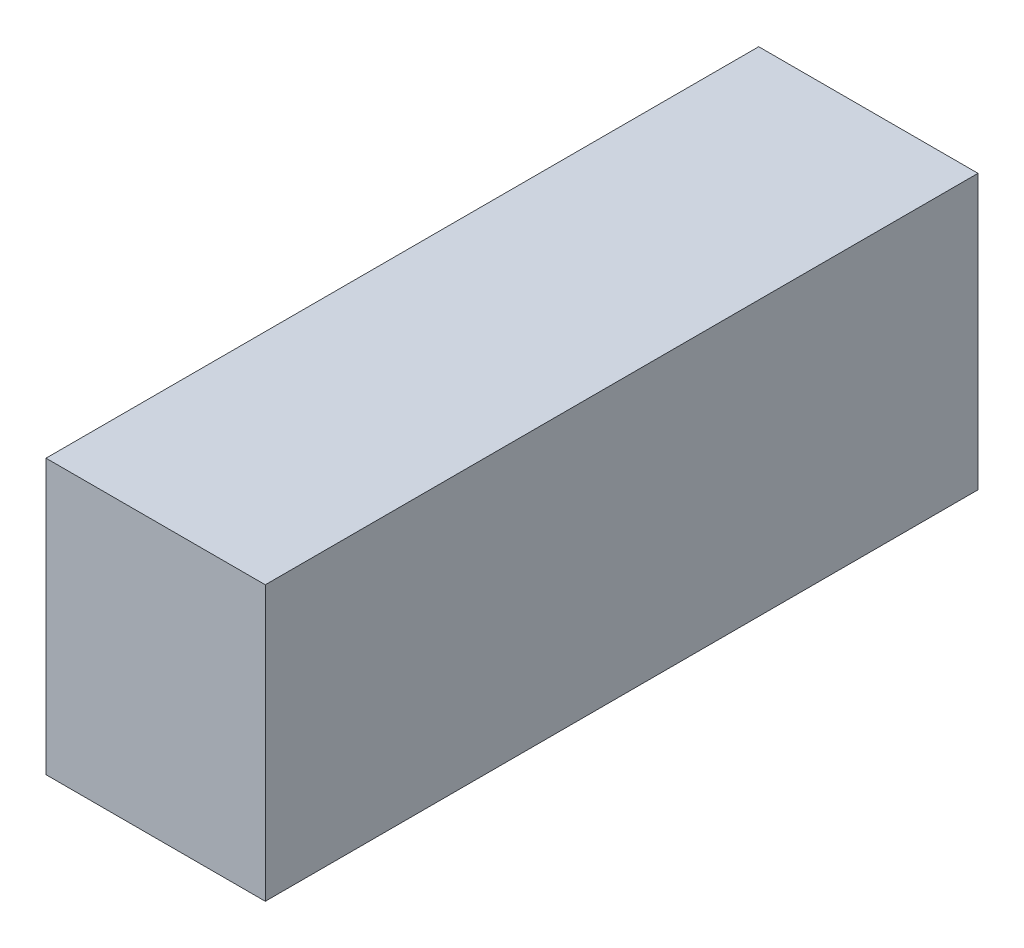
ISO-10303-21;
HEADER;
FILE_DESCRIPTION(('STEP AP214'),'2;1');
FILE_NAME('part.step','',(''),(''),'','','');
FILE_SCHEMA(('AUTOMOTIVE_DESIGN { 1 0 10303 214 1 1 1 1 }'));
ENDSEC;
DATA;
#1=APPLICATION_CONTEXT('core data for automotive mechanical design processes');
#2=APPLICATION_PROTOCOL_DEFINITION('international standard','automotive_design',2000,#1);
#3=PRODUCT_CONTEXT('',#1,'mechanical');
#4=PRODUCT('Part','Part','',(#3));
#5=PRODUCT_RELATED_PRODUCT_CATEGORY('part','',(#4));
#6=PRODUCT_DEFINITION_FORMATION('','',#4);
#7=PRODUCT_DEFINITION_CONTEXT('part definition',#1,'design');
#8=PRODUCT_DEFINITION('design','',#6,#7);
#9=PRODUCT_DEFINITION_SHAPE('','',#8);
#10=(LENGTH_UNIT() NAMED_UNIT(*) SI_UNIT(.MILLI.,.METRE.));
#11=(NAMED_UNIT(*) PLANE_ANGLE_UNIT() SI_UNIT($,.RADIAN.));
#12=(NAMED_UNIT(*) SI_UNIT($,.STERADIAN.) SOLID_ANGLE_UNIT());
#13=UNCERTAINTY_MEASURE_WITH_UNIT(LENGTH_MEASURE(1.E-05),#10,'distance_accuracy_value','');
#14=(GEOMETRIC_REPRESENTATION_CONTEXT(3) GLOBAL_UNCERTAINTY_ASSIGNED_CONTEXT((#13)) GLOBAL_UNIT_ASSIGNED_CONTEXT((#10,
#11,#12)) REPRESENTATION_CONTEXT('',''));
#15=CARTESIAN_POINT('',(0.,0.,0.));
#16=DIRECTION('',(0.,0.,1.));
#17=DIRECTION('',(1.,0.,0.));
#18=AXIS2_PLACEMENT_3D('',#15,#16,#17);
#19=CARTESIAN_POINT('',(-16.04373473862,16.0565625091568,115.57));
#20=DIRECTION('',(1.,0.,0.));
#21=DIRECTION('',(0.,1.,0.));
#22=AXIS2_PLACEMENT_3D('',#19,#20,#21);
#23=PLANE('',#22);
#24=DIRECTION('',(0.,-1.,0.));
#25=VECTOR('',#24,1.);
#26=CARTESIAN_POINT('',(-16.04373473862,16.0565625091568,0.));
#27=LINE('',#26,#25);
#28=CARTESIAN_POINT('',(-16.04373473862,16.0565625091568,0.));
#29=VERTEX_POINT('',#28);
#30=CARTESIAN_POINT('',(-16.04373473862,-28.3934374908432,0.));
#31=VERTEX_POINT('',#30);
#32=EDGE_CURVE('E95',#29,#31,#27,.T.);
#33=ORIENTED_EDGE('',*,*,#32,.T.);
#34=DIRECTION('',(0.,0.,-1.));
#35=VECTOR('',#34,1.);
#36=CARTESIAN_POINT('',(-16.04373473862,-28.3934374908432,115.57));
#37=LINE('',#36,#35);
#38=CARTESIAN_POINT('',(-16.04373473862,-28.3934374908432,115.57));
#39=VERTEX_POINT('',#38);
#40=EDGE_CURVE('E11',#39,#31,#37,.T.);
#41=ORIENTED_EDGE('',*,*,#40,.F.);
#42=DIRECTION('',(0.,-1.,0.));
#43=VECTOR('',#42,1.);
#44=CARTESIAN_POINT('',(-16.04373473862,16.0565625091568,115.57));
#45=LINE('',#44,#43);
#46=CARTESIAN_POINT('',(-16.04373473862,16.0565625091568,115.57));
#47=VERTEX_POINT('',#46);
#48=EDGE_CURVE('E83',#47,#39,#45,.T.);
#49=ORIENTED_EDGE('',*,*,#48,.F.);
#50=DIRECTION('',(0.,0.,-1.));
#51=VECTOR('',#50,1.);
#52=CARTESIAN_POINT('',(-16.04373473862,16.0565625091568,115.57));
#53=LINE('',#52,#51);
#54=EDGE_CURVE('E91',#47,#29,#53,.T.);
#55=ORIENTED_EDGE('',*,*,#54,.T.);
#56=EDGE_LOOP('',(#33,#41,#49,#55));
#57=FACE_BOUND('',#56,.T.);
#58=ADVANCED_FACE('F32',(#57),#23,.F.);
#59=CARTESIAN_POINT('',(-16.04373473862,-28.3934374908432,115.57));
#60=DIRECTION('',(0.,1.,0.));
#61=DIRECTION('',(0.,0.,1.));
#62=AXIS2_PLACEMENT_3D('',#59,#60,#61);
#63=PLANE('',#62);
#64=DIRECTION('',(1.,0.,0.));
#65=VECTOR('',#64,1.);
#66=CARTESIAN_POINT('',(-16.04373473862,-28.3934374908432,0.));
#67=LINE('',#66,#65);
#68=CARTESIAN_POINT('',(19.51626526138,-28.3934374908432,0.));
#69=VERTEX_POINT('',#68);
#70=EDGE_CURVE('E87',#31,#69,#67,.T.);
#71=ORIENTED_EDGE('',*,*,#70,.T.);
#72=DIRECTION('',(0.,0.,-1.));
#73=VECTOR('',#72,1.);
#74=CARTESIAN_POINT('',(19.51626526138,-28.3934374908432,115.57));
#75=LINE('',#74,#73);
#76=CARTESIAN_POINT('',(19.51626526138,-28.3934374908432,115.57));
#77=VERTEX_POINT('',#76);
#78=EDGE_CURVE('E40',#77,#69,#75,.T.);
#79=ORIENTED_EDGE('',*,*,#78,.F.);
#80=DIRECTION('',(1.,0.,0.));
#81=VECTOR('',#80,1.);
#82=CARTESIAN_POINT('',(-16.04373473862,-28.3934374908432,115.57));
#83=LINE('',#82,#81);
#84=EDGE_CURVE('E78',#39,#77,#83,.T.);
#85=ORIENTED_EDGE('',*,*,#84,.F.);
#86=ORIENTED_EDGE('',*,*,#40,.T.);
#87=EDGE_LOOP('',(#71,#79,#85,#86));
#88=FACE_BOUND('',#87,.T.);
#89=ADVANCED_FACE('F86',(#88),#63,.F.);
#90=CARTESIAN_POINT('',(19.51626526138,16.0565625091568,115.57));
#91=DIRECTION('',(-1.,0.,0.));
#92=DIRECTION('',(0.,-1.,0.));
#93=AXIS2_PLACEMENT_3D('',#90,#91,#92);
#94=PLANE('',#93);
#95=DIRECTION('',(0.,1.,0.));
#96=VECTOR('',#95,1.);
#97=CARTESIAN_POINT('',(19.51626526138,16.0565625091568,0.));
#98=LINE('',#97,#96);
#99=CARTESIAN_POINT('',(19.51626526138,16.0565625091568,0.));
#100=VERTEX_POINT('',#99);
#101=EDGE_CURVE('E65',#69,#100,#98,.T.);
#102=ORIENTED_EDGE('',*,*,#101,.T.);
#103=DIRECTION('',(0.,0.,-1.));
#104=VECTOR('',#103,1.);
#105=CARTESIAN_POINT('',(19.51626526138,16.0565625091568,115.57));
#106=LINE('',#105,#104);
#107=CARTESIAN_POINT('',(19.51626526138,16.0565625091568,115.57));
#108=VERTEX_POINT('',#107);
#109=EDGE_CURVE('E88',#108,#100,#106,.T.);
#110=ORIENTED_EDGE('',*,*,#109,.F.);
#111=DIRECTION('',(0.,1.,0.));
#112=VECTOR('',#111,1.);
#113=CARTESIAN_POINT('',(19.51626526138,16.0565625091568,115.57));
#114=LINE('',#113,#112);
#115=EDGE_CURVE('E81',#77,#108,#114,.T.);
#116=ORIENTED_EDGE('',*,*,#115,.F.);
#117=ORIENTED_EDGE('',*,*,#78,.T.);
#118=EDGE_LOOP('',(#102,#110,#116,#117));
#119=FACE_BOUND('',#118,.T.);
#120=ADVANCED_FACE('F89',(#119),#94,.F.);
#121=CARTESIAN_POINT('',(-16.04373473862,16.0565625091568,115.57));
#122=DIRECTION('',(0.,-1.,0.));
#123=DIRECTION('',(0.,0.,-1.));
#124=AXIS2_PLACEMENT_3D('',#121,#122,#123);
#125=PLANE('',#124);
#126=DIRECTION('',(-1.,0.,0.));
#127=VECTOR('',#126,1.);
#128=CARTESIAN_POINT('',(-16.04373473862,16.0565625091568,0.));
#129=LINE('',#128,#127);
#130=EDGE_CURVE('E71',#100,#29,#129,.T.);
#131=ORIENTED_EDGE('',*,*,#130,.T.);
#132=ORIENTED_EDGE('',*,*,#54,.F.);
#133=DIRECTION('',(-1.,0.,0.));
#134=VECTOR('',#133,1.);
#135=CARTESIAN_POINT('',(-16.04373473862,16.0565625091568,115.57));
#136=LINE('',#135,#134);
#137=EDGE_CURVE('E48',#108,#47,#136,.T.);
#138=ORIENTED_EDGE('',*,*,#137,.F.);
#139=ORIENTED_EDGE('',*,*,#109,.T.);
#140=EDGE_LOOP('',(#131,#132,#138,#139));
#141=FACE_BOUND('',#140,.T.);
#142=ADVANCED_FACE('F102',(#141),#125,.F.);
#143=CARTESIAN_POINT('',(0.,0.,115.57));
#144=DIRECTION('',(0.,0.,1.));
#145=DIRECTION('',(1.,0.,0.));
#146=AXIS2_PLACEMENT_3D('',#143,#144,#145);
#147=PLANE('',#146);
#148=ORIENTED_EDGE('',*,*,#48,.T.);
#149=ORIENTED_EDGE('',*,*,#84,.T.);
#150=ORIENTED_EDGE('',*,*,#115,.T.);
#151=ORIENTED_EDGE('',*,*,#137,.T.);
#152=EDGE_LOOP('',(#148,#149,#150,#151));
#153=FACE_BOUND('',#152,.T.);
#154=ADVANCED_FACE('F79',(#153),#147,.T.);
#155=CARTESIAN_POINT('',(0.,0.,0.));
#156=DIRECTION('',(0.,0.,1.));
#157=DIRECTION('',(1.,0.,0.));
#158=AXIS2_PLACEMENT_3D('',#155,#156,#157);
#159=PLANE('',#158);
#160=ORIENTED_EDGE('',*,*,#32,.F.);
#161=ORIENTED_EDGE('',*,*,#130,.F.);
#162=ORIENTED_EDGE('',*,*,#101,.F.);
#163=ORIENTED_EDGE('',*,*,#70,.F.);
#164=EDGE_LOOP('',(#160,#161,#162,#163));
#165=FACE_BOUND('',#164,.T.);
#166=ADVANCED_FACE('F105',(#165),#159,.F.);
#167=CLOSED_SHELL('',(#58,#89,#120,#142,#154,#166));
#168=MANIFOLD_SOLID_BREP('B2',#167);
#169=ADVANCED_BREP_SHAPE_REPRESENTATION('',(#18,#168),#14);
#170=SHAPE_DEFINITION_REPRESENTATION(#9,#169);
ENDSEC;
END-ISO-10303-21;
